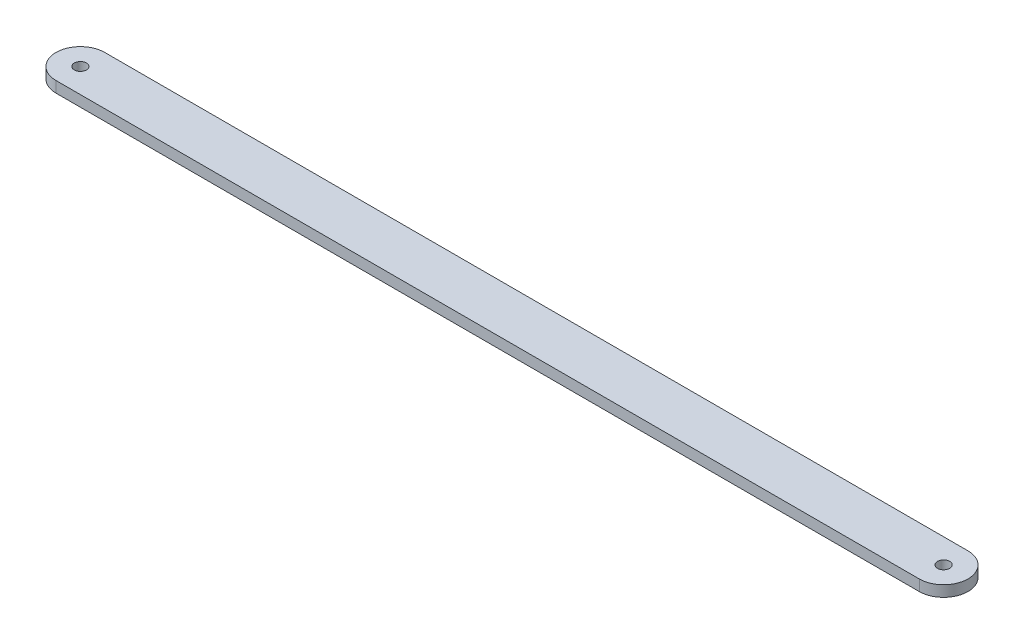
ISO-10303-21;
HEADER;
FILE_DESCRIPTION(('STEP AP214'),'2;1');
FILE_NAME('part.step','',(''),(''),'','','');
FILE_SCHEMA(('AUTOMOTIVE_DESIGN { 1 0 10303 214 1 1 1 1 }'));
ENDSEC;
DATA;
#1=APPLICATION_CONTEXT('core data for automotive mechanical design processes');
#2=APPLICATION_PROTOCOL_DEFINITION('international standard','automotive_design',2000,#1);
#3=PRODUCT_CONTEXT('',#1,'mechanical');
#4=PRODUCT('Part','Part','',(#3));
#5=PRODUCT_RELATED_PRODUCT_CATEGORY('part','',(#4));
#6=PRODUCT_DEFINITION_FORMATION('','',#4);
#7=PRODUCT_DEFINITION_CONTEXT('part definition',#1,'design');
#8=PRODUCT_DEFINITION('design','',#6,#7);
#9=PRODUCT_DEFINITION_SHAPE('','',#8);
#10=(LENGTH_UNIT() NAMED_UNIT(*) SI_UNIT(.MILLI.,.METRE.));
#11=(NAMED_UNIT(*) PLANE_ANGLE_UNIT() SI_UNIT($,.RADIAN.));
#12=(NAMED_UNIT(*) SI_UNIT($,.STERADIAN.) SOLID_ANGLE_UNIT());
#13=UNCERTAINTY_MEASURE_WITH_UNIT(LENGTH_MEASURE(1.E-05),#10,'distance_accuracy_value','');
#14=(GEOMETRIC_REPRESENTATION_CONTEXT(3) GLOBAL_UNCERTAINTY_ASSIGNED_CONTEXT((#13)) GLOBAL_UNIT_ASSIGNED_CONTEXT((#10,
#11,#12)) REPRESENTATION_CONTEXT('',''));
#15=CARTESIAN_POINT('',(0.,0.,0.));
#16=DIRECTION('',(0.,0.,1.));
#17=DIRECTION('',(1.,0.,0.));
#18=AXIS2_PLACEMENT_3D('',#15,#16,#17);
#19=CARTESIAN_POINT('',(-177.245,4.5,0.));
#20=DIRECTION('',(0.,1.,0.));
#21=DIRECTION('',(0.,0.,1.));
#22=AXIS2_PLACEMENT_3D('',#19,#20,#21);
#23=PLANE('',#22);
#24=CARTESIAN_POINT('',(-177.245,4.5,0.));
#25=DIRECTION('',(0.,1.,0.));
#26=DIRECTION('',(0.,0.,1.));
#27=AXIS2_PLACEMENT_3D('',#24,#25,#26);
#28=CIRCLE('',#27,2.5);
#29=CARTESIAN_POINT('',(-177.245,4.5,2.5));
#30=VERTEX_POINT('',#29);
#31=EDGE_CURVE('E103',#30,#30,#28,.T.);
#32=ORIENTED_EDGE('',*,*,#31,.F.);
#33=EDGE_LOOP('',(#32));
#34=FACE_BOUND('',#33,.T.);
#35=CARTESIAN_POINT('',(-177.245,4.5,0.));
#36=DIRECTION('',(0.,1.,0.));
#37=DIRECTION('',(0.,0.,1.));
#38=AXIS2_PLACEMENT_3D('',#35,#36,#37);
#39=CIRCLE('',#38,10.);
#40=CARTESIAN_POINT('',(-177.245,4.5,-10.));
#41=VERTEX_POINT('',#40);
#42=CARTESIAN_POINT('',(-177.245,4.5,10.));
#43=VERTEX_POINT('',#42);
#44=EDGE_CURVE('E88',#41,#43,#39,.T.);
#45=ORIENTED_EDGE('',*,*,#44,.T.);
#46=DIRECTION('',(1.,0.,0.));
#47=VECTOR('',#46,1.);
#48=CARTESIAN_POINT('',(-177.245,4.5,10.));
#49=LINE('',#48,#47);
#50=CARTESIAN_POINT('',(177.245,4.5,9.99999999999993));
#51=VERTEX_POINT('',#50);
#52=EDGE_CURVE('E83',#43,#51,#49,.T.);
#53=ORIENTED_EDGE('',*,*,#52,.T.);
#54=CARTESIAN_POINT('',(177.245,4.5,0.));
#55=DIRECTION('',(0.,1.,0.));
#56=DIRECTION('',(0.,0.,1.));
#57=AXIS2_PLACEMENT_3D('',#54,#55,#56);
#58=CIRCLE('',#57,10.);
#59=CARTESIAN_POINT('',(177.245,4.5,-10.0000000000001));
#60=VERTEX_POINT('',#59);
#61=EDGE_CURVE('E86',#51,#60,#58,.T.);
#62=ORIENTED_EDGE('',*,*,#61,.T.);
#63=DIRECTION('',(-1.,0.,0.));
#64=VECTOR('',#63,1.);
#65=CARTESIAN_POINT('',(-177.245,4.5,-10.));
#66=LINE('',#65,#64);
#67=EDGE_CURVE('E53',#60,#41,#66,.T.);
#68=ORIENTED_EDGE('',*,*,#67,.T.);
#69=EDGE_LOOP('',(#45,#53,#62,#68));
#70=FACE_BOUND('',#69,.T.);
#71=CARTESIAN_POINT('',(177.245,4.5,0.));
#72=DIRECTION('',(0.,1.,0.));
#73=DIRECTION('',(0.,0.,1.));
#74=AXIS2_PLACEMENT_3D('',#71,#72,#73);
#75=CIRCLE('',#74,2.5);
#76=CARTESIAN_POINT('',(177.245,4.5,2.49999999999993));
#77=VERTEX_POINT('',#76);
#78=EDGE_CURVE('E118',#77,#77,#75,.T.);
#79=ORIENTED_EDGE('',*,*,#78,.F.);
#80=EDGE_LOOP('',(#79));
#81=FACE_BOUND('',#80,.T.);
#82=ADVANCED_FACE('F36',(#34,#70,#81),#23,.T.);
#83=CARTESIAN_POINT('',(-177.245,0.,0.));
#84=DIRECTION('',(0.,1.,0.));
#85=DIRECTION('',(0.,0.,1.));
#86=AXIS2_PLACEMENT_3D('',#83,#84,#85);
#87=PLANE('',#86);
#88=CARTESIAN_POINT('',(-177.245,0.,0.));
#89=DIRECTION('',(0.,1.,0.));
#90=DIRECTION('',(0.,0.,1.));
#91=AXIS2_PLACEMENT_3D('',#88,#89,#90);
#92=CIRCLE('',#91,10.);
#93=CARTESIAN_POINT('',(-177.245,0.,-10.));
#94=VERTEX_POINT('',#93);
#95=CARTESIAN_POINT('',(-177.245,0.,10.));
#96=VERTEX_POINT('',#95);
#97=EDGE_CURVE('E100',#94,#96,#92,.T.);
#98=ORIENTED_EDGE('',*,*,#97,.F.);
#99=DIRECTION('',(-1.,0.,0.));
#100=VECTOR('',#99,1.);
#101=CARTESIAN_POINT('',(-177.245,0.,-10.));
#102=LINE('',#101,#100);
#103=CARTESIAN_POINT('',(177.245,0.,-10.0000000000001));
#104=VERTEX_POINT('',#103);
#105=EDGE_CURVE('E76',#104,#94,#102,.T.);
#106=ORIENTED_EDGE('',*,*,#105,.F.);
#107=CARTESIAN_POINT('',(177.245,0.,0.));
#108=DIRECTION('',(0.,1.,0.));
#109=DIRECTION('',(0.,0.,1.));
#110=AXIS2_PLACEMENT_3D('',#107,#108,#109);
#111=CIRCLE('',#110,10.);
#112=CARTESIAN_POINT('',(177.245,0.,9.99999999999993));
#113=VERTEX_POINT('',#112);
#114=EDGE_CURVE('E70',#113,#104,#111,.T.);
#115=ORIENTED_EDGE('',*,*,#114,.F.);
#116=DIRECTION('',(1.,0.,0.));
#117=VECTOR('',#116,1.);
#118=CARTESIAN_POINT('',(-177.245,0.,10.));
#119=LINE('',#118,#117);
#120=EDGE_CURVE('E92',#96,#113,#119,.T.);
#121=ORIENTED_EDGE('',*,*,#120,.F.);
#122=EDGE_LOOP('',(#98,#106,#115,#121));
#123=FACE_BOUND('',#122,.T.);
#124=CARTESIAN_POINT('',(-177.245,0.,0.));
#125=DIRECTION('',(0.,1.,0.));
#126=DIRECTION('',(0.,0.,1.));
#127=AXIS2_PLACEMENT_3D('',#124,#125,#126);
#128=CIRCLE('',#127,2.5);
#129=CARTESIAN_POINT('',(-177.245,0.,2.5));
#130=VERTEX_POINT('',#129);
#131=EDGE_CURVE('E115',#130,#130,#128,.T.);
#132=ORIENTED_EDGE('',*,*,#131,.T.);
#133=EDGE_LOOP('',(#132));
#134=FACE_BOUND('',#133,.T.);
#135=CARTESIAN_POINT('',(177.245,0.,0.));
#136=DIRECTION('',(0.,1.,0.));
#137=DIRECTION('',(0.,0.,1.));
#138=AXIS2_PLACEMENT_3D('',#135,#136,#137);
#139=CIRCLE('',#138,2.5);
#140=CARTESIAN_POINT('',(177.245,0.,2.49999999999993));
#141=VERTEX_POINT('',#140);
#142=EDGE_CURVE('E121',#141,#141,#139,.T.);
#143=ORIENTED_EDGE('',*,*,#142,.T.);
#144=EDGE_LOOP('',(#143));
#145=FACE_BOUND('',#144,.T.);
#146=ADVANCED_FACE('F111',(#123,#134,#145),#87,.F.);
#147=CARTESIAN_POINT('',(-177.245,4.5,0.));
#148=DIRECTION('',(0.,-1.,0.));
#149=DIRECTION('',(0.,0.,-1.));
#150=AXIS2_PLACEMENT_3D('',#147,#148,#149);
#151=CYLINDRICAL_SURFACE('',#150,10.);
#152=ORIENTED_EDGE('',*,*,#97,.T.);
#153=DIRECTION('',(0.,-1.,0.));
#154=VECTOR('',#153,1.);
#155=CARTESIAN_POINT('',(-177.245,4.5,10.));
#156=LINE('',#155,#154);
#157=EDGE_CURVE('E11',#43,#96,#156,.T.);
#158=ORIENTED_EDGE('',*,*,#157,.F.);
#159=ORIENTED_EDGE('',*,*,#44,.F.);
#160=DIRECTION('',(0.,-1.,0.));
#161=VECTOR('',#160,1.);
#162=CARTESIAN_POINT('',(-177.245,4.5,-10.));
#163=LINE('',#162,#161);
#164=EDGE_CURVE('E96',#41,#94,#163,.T.);
#165=ORIENTED_EDGE('',*,*,#164,.T.);
#166=EDGE_LOOP('',(#152,#158,#159,#165));
#167=FACE_BOUND('',#166,.T.);
#168=ADVANCED_FACE('F38',(#167),#151,.T.);
#169=CARTESIAN_POINT('',(-177.245,4.5,10.));
#170=DIRECTION('',(0.,0.,-1.));
#171=DIRECTION('',(-1.,0.,0.));
#172=AXIS2_PLACEMENT_3D('',#169,#170,#171);
#173=PLANE('',#172);
#174=ORIENTED_EDGE('',*,*,#120,.T.);
#175=DIRECTION('',(0.,-1.,0.));
#176=VECTOR('',#175,1.);
#177=CARTESIAN_POINT('',(177.245,4.5,9.99999999999993));
#178=LINE('',#177,#176);
#179=EDGE_CURVE('E45',#51,#113,#178,.T.);
#180=ORIENTED_EDGE('',*,*,#179,.F.);
#181=ORIENTED_EDGE('',*,*,#52,.F.);
#182=ORIENTED_EDGE('',*,*,#157,.T.);
#183=EDGE_LOOP('',(#174,#180,#181,#182));
#184=FACE_BOUND('',#183,.T.);
#185=ADVANCED_FACE('F91',(#184),#173,.F.);
#186=CARTESIAN_POINT('',(177.245,4.5,0.));
#187=DIRECTION('',(0.,-1.,0.));
#188=DIRECTION('',(0.,0.,-1.));
#189=AXIS2_PLACEMENT_3D('',#186,#187,#188);
#190=CYLINDRICAL_SURFACE('',#189,10.);
#191=ORIENTED_EDGE('',*,*,#114,.T.);
#192=DIRECTION('',(0.,-1.,0.));
#193=VECTOR('',#192,1.);
#194=CARTESIAN_POINT('',(177.245,4.5,-10.0000000000001));
#195=LINE('',#194,#193);
#196=EDGE_CURVE('E93',#60,#104,#195,.T.);
#197=ORIENTED_EDGE('',*,*,#196,.F.);
#198=ORIENTED_EDGE('',*,*,#61,.F.);
#199=ORIENTED_EDGE('',*,*,#179,.T.);
#200=EDGE_LOOP('',(#191,#197,#198,#199));
#201=FACE_BOUND('',#200,.T.);
#202=ADVANCED_FACE('F94',(#201),#190,.T.);
#203=CARTESIAN_POINT('',(-177.245,4.5,-10.));
#204=DIRECTION('',(0.,0.,1.));
#205=DIRECTION('',(1.,0.,0.));
#206=AXIS2_PLACEMENT_3D('',#203,#204,#205);
#207=PLANE('',#206);
#208=ORIENTED_EDGE('',*,*,#105,.T.);
#209=ORIENTED_EDGE('',*,*,#164,.F.);
#210=ORIENTED_EDGE('',*,*,#67,.F.);
#211=ORIENTED_EDGE('',*,*,#196,.T.);
#212=EDGE_LOOP('',(#208,#209,#210,#211));
#213=FACE_BOUND('',#212,.T.);
#214=ADVANCED_FACE('F108',(#213),#207,.F.);
#215=CARTESIAN_POINT('',(-177.245,4.5,0.));
#216=DIRECTION('',(0.,-1.,0.));
#217=DIRECTION('',(0.,0.,-1.));
#218=AXIS2_PLACEMENT_3D('',#215,#216,#217);
#219=CYLINDRICAL_SURFACE('',#218,2.5);
#220=ORIENTED_EDGE('',*,*,#31,.T.);
#221=EDGE_LOOP('',(#220));
#222=FACE_BOUND('',#221,.T.);
#223=ORIENTED_EDGE('',*,*,#131,.F.);
#224=EDGE_LOOP('',(#223));
#225=FACE_BOUND('',#224,.T.);
#226=ADVANCED_FACE('F138',(#222,#225),#219,.F.);
#227=CARTESIAN_POINT('',(177.245,4.5,0.));
#228=DIRECTION('',(0.,-1.,0.));
#229=DIRECTION('',(0.,0.,-1.));
#230=AXIS2_PLACEMENT_3D('',#227,#228,#229);
#231=CYLINDRICAL_SURFACE('',#230,2.5);
#232=ORIENTED_EDGE('',*,*,#78,.T.);
#233=EDGE_LOOP('',(#232));
#234=FACE_BOUND('',#233,.T.);
#235=ORIENTED_EDGE('',*,*,#142,.F.);
#236=EDGE_LOOP('',(#235));
#237=FACE_BOUND('',#236,.T.);
#238=ADVANCED_FACE('F127',(#234,#237),#231,.F.);
#239=CLOSED_SHELL('',(#82,#146,#168,#185,#202,#214,#226,#238));
#240=MANIFOLD_SOLID_BREP('B2',#239);
#241=ADVANCED_BREP_SHAPE_REPRESENTATION('',(#18,#240),#14);
#242=SHAPE_DEFINITION_REPRESENTATION(#9,#241);
ENDSEC;
END-ISO-10303-21;
